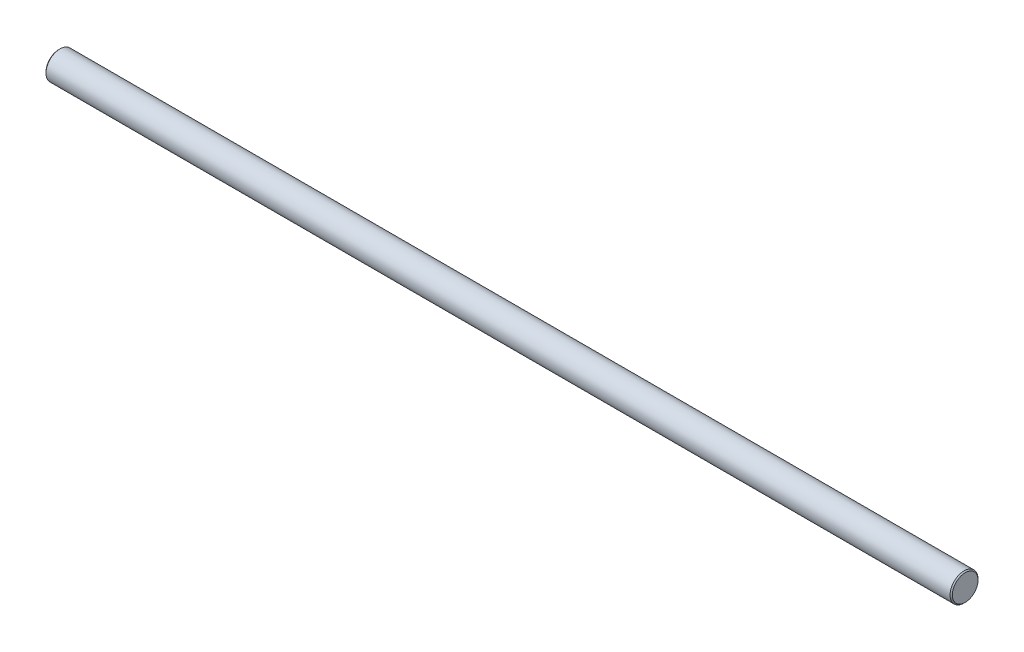
ISO-10303-21;
HEADER;
FILE_DESCRIPTION(('STEP AP214'),'2;1');
FILE_NAME('part.step','',(''),(''),'','','');
FILE_SCHEMA(('AUTOMOTIVE_DESIGN { 1 0 10303 214 1 1 1 1 }'));
ENDSEC;
DATA;
#1=APPLICATION_CONTEXT('core data for automotive mechanical design processes');
#2=APPLICATION_PROTOCOL_DEFINITION('international standard','automotive_design',2000,#1);
#3=PRODUCT_CONTEXT('',#1,'mechanical');
#4=PRODUCT('Part','Part','',(#3));
#5=PRODUCT_RELATED_PRODUCT_CATEGORY('part','',(#4));
#6=PRODUCT_DEFINITION_FORMATION('','',#4);
#7=PRODUCT_DEFINITION_CONTEXT('part definition',#1,'design');
#8=PRODUCT_DEFINITION('design','',#6,#7);
#9=PRODUCT_DEFINITION_SHAPE('','',#8);
#10=(LENGTH_UNIT() NAMED_UNIT(*) SI_UNIT(.MILLI.,.METRE.));
#11=(NAMED_UNIT(*) PLANE_ANGLE_UNIT() SI_UNIT($,.RADIAN.));
#12=(NAMED_UNIT(*) SI_UNIT($,.STERADIAN.) SOLID_ANGLE_UNIT());
#13=UNCERTAINTY_MEASURE_WITH_UNIT(LENGTH_MEASURE(1.E-05),#10,'distance_accuracy_value','');
#14=(GEOMETRIC_REPRESENTATION_CONTEXT(3) GLOBAL_UNCERTAINTY_ASSIGNED_CONTEXT((#13)) GLOBAL_UNIT_ASSIGNED_CONTEXT((#10,
#11,#12)) REPRESENTATION_CONTEXT('',''));
#15=CARTESIAN_POINT('',(0.,0.,0.));
#16=DIRECTION('',(0.,0.,1.));
#17=DIRECTION('',(1.,0.,0.));
#18=AXIS2_PLACEMENT_3D('',#15,#16,#17);
#19=CARTESIAN_POINT('',(810.,11.5,0.));
#20=DIRECTION('',(1.,0.,0.));
#21=DIRECTION('',(0.,1.,0.));
#22=AXIS2_PLACEMENT_3D('',#19,#20,#21);
#23=PLANE('',#22);
#24=CARTESIAN_POINT('',(810.,0.,0.));
#25=DIRECTION('',(-1.,0.,0.));
#26=DIRECTION('',(0.,0.,1.));
#27=AXIS2_PLACEMENT_3D('',#24,#25,#26);
#28=CIRCLE('',#27,11.5);
#29=CARTESIAN_POINT('',(810.,0.,11.5));
#30=VERTEX_POINT('',#29);
#31=EDGE_CURVE('E11',#30,#30,#28,.T.);
#32=ORIENTED_EDGE('',*,*,#31,.F.);
#33=EDGE_LOOP('',(#32));
#34=FACE_BOUND('',#33,.T.);
#35=ADVANCED_FACE('F16',(#34),#23,.T.);
#36=CARTESIAN_POINT('',(809.,0.,0.));
#37=DIRECTION('',(-1.,0.,0.));
#38=DIRECTION('',(0.,0.,1.));
#39=AXIS2_PLACEMENT_3D('',#36,#37,#38);
#40=CONICAL_SURFACE('',#39,12.5,0.7853981625);
#41=CARTESIAN_POINT('',(809.,0.,0.));
#42=DIRECTION('',(-1.,0.,0.));
#43=DIRECTION('',(0.,0.,1.));
#44=AXIS2_PLACEMENT_3D('',#41,#42,#43);
#45=CIRCLE('',#44,12.5);
#46=CARTESIAN_POINT('',(809.,0.,12.5));
#47=VERTEX_POINT('',#46);
#48=EDGE_CURVE('E26',#47,#47,#45,.T.);
#49=ORIENTED_EDGE('',*,*,#48,.F.);
#50=EDGE_LOOP('',(#49));
#51=FACE_BOUND('',#50,.T.);
#52=ORIENTED_EDGE('',*,*,#31,.T.);
#53=EDGE_LOOP('',(#52));
#54=FACE_BOUND('',#53,.T.);
#55=ADVANCED_FACE('F64',(#51,#54),#40,.T.);
#56=CARTESIAN_POINT('',(810.,0.,0.));
#57=DIRECTION('',(-1.,0.,0.));
#58=DIRECTION('',(0.,0.,1.));
#59=AXIS2_PLACEMENT_3D('',#56,#57,#58);
#60=CYLINDRICAL_SURFACE('',#59,12.5);
#61=CARTESIAN_POINT('',(1.,0.,0.));
#62=DIRECTION('',(-1.,0.,0.));
#63=DIRECTION('',(0.,0.,1.));
#64=AXIS2_PLACEMENT_3D('',#61,#62,#63);
#65=CIRCLE('',#64,12.5);
#66=CARTESIAN_POINT('',(1.,0.,12.5));
#67=VERTEX_POINT('',#66);
#68=EDGE_CURVE('E44',#67,#67,#65,.T.);
#69=ORIENTED_EDGE('',*,*,#68,.F.);
#70=EDGE_LOOP('',(#69));
#71=FACE_BOUND('',#70,.T.);
#72=ORIENTED_EDGE('',*,*,#48,.T.);
#73=EDGE_LOOP('',(#72));
#74=FACE_BOUND('',#73,.T.);
#75=ADVANCED_FACE('F62',(#71,#74),#60,.T.);
#76=CARTESIAN_POINT('',(0.,0.,0.));
#77=DIRECTION('',(1.,0.,0.));
#78=DIRECTION('',(0.,0.,-1.));
#79=AXIS2_PLACEMENT_3D('',#76,#77,#78);
#80=CONICAL_SURFACE('',#79,11.5,0.7853981625);
#81=CARTESIAN_POINT('',(0.,0.,0.));
#82=DIRECTION('',(-1.,0.,0.));
#83=DIRECTION('',(0.,0.,1.));
#84=AXIS2_PLACEMENT_3D('',#81,#82,#83);
#85=CIRCLE('',#84,11.5);
#86=CARTESIAN_POINT('',(0.,0.,11.5));
#87=VERTEX_POINT('',#86);
#88=EDGE_CURVE('E51',#87,#87,#85,.T.);
#89=ORIENTED_EDGE('',*,*,#88,.F.);
#90=EDGE_LOOP('',(#89));
#91=FACE_BOUND('',#90,.T.);
#92=ORIENTED_EDGE('',*,*,#68,.T.);
#93=EDGE_LOOP('',(#92));
#94=FACE_BOUND('',#93,.T.);
#95=ADVANCED_FACE('F72',(#91,#94),#80,.T.);
#96=CARTESIAN_POINT('',(0.,0.,0.));
#97=DIRECTION('',(-1.,0.,0.));
#98=DIRECTION('',(0.,0.,1.));
#99=AXIS2_PLACEMENT_3D('',#96,#97,#98);
#100=PLANE('',#99);
#101=ORIENTED_EDGE('',*,*,#88,.T.);
#102=EDGE_LOOP('',(#101));
#103=FACE_BOUND('',#102,.T.);
#104=ADVANCED_FACE('F18',(#103),#100,.T.);
#105=CLOSED_SHELL('',(#35,#55,#75,#95,#104));
#106=MANIFOLD_SOLID_BREP('B1',#105);
#107=ADVANCED_BREP_SHAPE_REPRESENTATION('',(#18,#106),#14);
#108=SHAPE_DEFINITION_REPRESENTATION(#9,#107);
ENDSEC;
END-ISO-10303-21;
